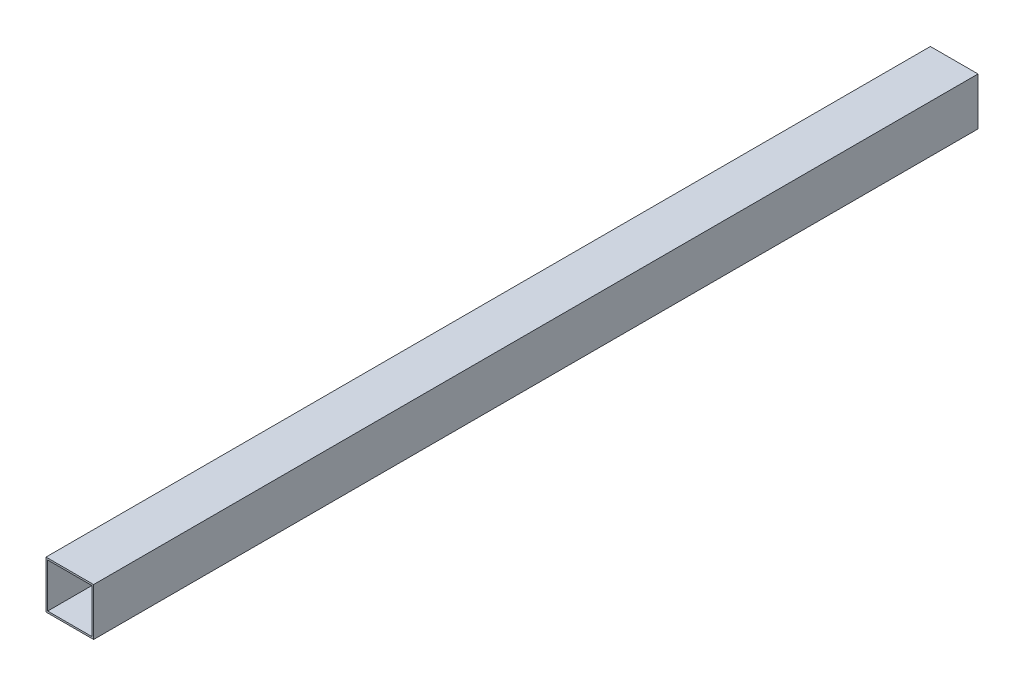
ISO-10303-21;
HEADER;
FILE_DESCRIPTION(('STEP AP214'),'2;1');
FILE_NAME('part.step','',(''),(''),'','','');
FILE_SCHEMA(('AUTOMOTIVE_DESIGN { 1 0 10303 214 1 1 1 1 }'));
ENDSEC;
DATA;
#1=APPLICATION_CONTEXT('core data for automotive mechanical design processes');
#2=APPLICATION_PROTOCOL_DEFINITION('international standard','automotive_design',2000,#1);
#3=PRODUCT_CONTEXT('',#1,'mechanical');
#4=PRODUCT('Part','Part','',(#3));
#5=PRODUCT_RELATED_PRODUCT_CATEGORY('part','',(#4));
#6=PRODUCT_DEFINITION_FORMATION('','',#4);
#7=PRODUCT_DEFINITION_CONTEXT('part definition',#1,'design');
#8=PRODUCT_DEFINITION('design','',#6,#7);
#9=PRODUCT_DEFINITION_SHAPE('','',#8);
#10=(LENGTH_UNIT() NAMED_UNIT(*) SI_UNIT(.MILLI.,.METRE.));
#11=(NAMED_UNIT(*) PLANE_ANGLE_UNIT() SI_UNIT($,.RADIAN.));
#12=(NAMED_UNIT(*) SI_UNIT($,.STERADIAN.) SOLID_ANGLE_UNIT());
#13=UNCERTAINTY_MEASURE_WITH_UNIT(LENGTH_MEASURE(1.E-05),#10,'distance_accuracy_value','');
#14=(GEOMETRIC_REPRESENTATION_CONTEXT(3) GLOBAL_UNCERTAINTY_ASSIGNED_CONTEXT((#13)) GLOBAL_UNIT_ASSIGNED_CONTEXT((#10,
#11,#12)) REPRESENTATION_CONTEXT('',''));
#15=CARTESIAN_POINT('',(0.,0.,0.));
#16=DIRECTION('',(0.,0.,1.));
#17=DIRECTION('',(1.,0.,0.));
#18=AXIS2_PLACEMENT_3D('',#15,#16,#17);
#19=CARTESIAN_POINT('',(0.,0.,650.));
#20=DIRECTION('',(0.,0.,1.));
#21=DIRECTION('',(1.,0.,0.));
#22=AXIS2_PLACEMENT_3D('',#19,#20,#21);
#23=PLANE('',#22);
#24=DIRECTION('',(0.,-1.,0.));
#25=VECTOR('',#24,1.);
#26=CARTESIAN_POINT('',(-35.,-35.,650.));
#27=LINE('',#26,#25);
#28=CARTESIAN_POINT('',(-35.,35.,650.));
#29=VERTEX_POINT('',#28);
#30=CARTESIAN_POINT('',(-35.,-35.,650.));
#31=VERTEX_POINT('',#30);
#32=EDGE_CURVE('E133',#29,#31,#27,.T.);
#33=ORIENTED_EDGE('',*,*,#32,.T.);
#34=DIRECTION('',(1.,0.,0.));
#35=VECTOR('',#34,1.);
#36=CARTESIAN_POINT('',(35.,-35.,650.));
#37=LINE('',#36,#35);
#38=CARTESIAN_POINT('',(35.,-35.,650.));
#39=VERTEX_POINT('',#38);
#40=EDGE_CURVE('E136',#31,#39,#37,.T.);
#41=ORIENTED_EDGE('',*,*,#40,.T.);
#42=DIRECTION('',(0.,1.,0.));
#43=VECTOR('',#42,1.);
#44=CARTESIAN_POINT('',(35.,-35.,650.));
#45=LINE('',#44,#43);
#46=CARTESIAN_POINT('',(35.,35.,650.));
#47=VERTEX_POINT('',#46);
#48=EDGE_CURVE('E139',#39,#47,#45,.T.);
#49=ORIENTED_EDGE('',*,*,#48,.T.);
#50=DIRECTION('',(-1.,0.,0.));
#51=VECTOR('',#50,1.);
#52=CARTESIAN_POINT('',(35.,35.,650.));
#53=LINE('',#52,#51);
#54=EDGE_CURVE('E141',#47,#29,#53,.T.);
#55=ORIENTED_EDGE('',*,*,#54,.T.);
#56=EDGE_LOOP('',(#33,#41,#49,#55));
#57=FACE_BOUND('',#56,.T.);
#58=DIRECTION('',(0.,1.,0.));
#59=VECTOR('',#58,1.);
#60=CARTESIAN_POINT('',(32.5,-32.5,650.));
#61=LINE('',#60,#59);
#62=CARTESIAN_POINT('',(32.5,-32.5,650.));
#63=VERTEX_POINT('',#62);
#64=CARTESIAN_POINT('',(32.5,32.5,650.));
#65=VERTEX_POINT('',#64);
#66=EDGE_CURVE('E105',#63,#65,#61,.T.);
#67=ORIENTED_EDGE('',*,*,#66,.F.);
#68=DIRECTION('',(1.,0.,0.));
#69=VECTOR('',#68,1.);
#70=CARTESIAN_POINT('',(32.5,-32.5,650.));
#71=LINE('',#70,#69);
#72=CARTESIAN_POINT('',(-32.5,-32.5,650.));
#73=VERTEX_POINT('',#72);
#74=EDGE_CURVE('E97',#73,#63,#71,.T.);
#75=ORIENTED_EDGE('',*,*,#74,.F.);
#76=DIRECTION('',(0.,-1.,0.));
#77=VECTOR('',#76,1.);
#78=CARTESIAN_POINT('',(-32.5,-32.5,650.));
#79=LINE('',#78,#77);
#80=CARTESIAN_POINT('',(-32.5,32.5,650.));
#81=VERTEX_POINT('',#80);
#82=EDGE_CURVE('E119',#81,#73,#79,.T.);
#83=ORIENTED_EDGE('',*,*,#82,.F.);
#84=DIRECTION('',(-1.,0.,0.));
#85=VECTOR('',#84,1.);
#86=CARTESIAN_POINT('',(32.5,32.5,650.));
#87=LINE('',#86,#85);
#88=EDGE_CURVE('E117',#65,#81,#87,.T.);
#89=ORIENTED_EDGE('',*,*,#88,.F.);
#90=EDGE_LOOP('',(#67,#75,#83,#89));
#91=FACE_BOUND('',#90,.T.);
#92=ADVANCED_FACE('F32',(#57,#91),#23,.T.);
#93=CARTESIAN_POINT('',(0.,0.,-650.));
#94=DIRECTION('',(0.,0.,1.));
#95=DIRECTION('',(1.,0.,0.));
#96=AXIS2_PLACEMENT_3D('',#93,#94,#95);
#97=PLANE('',#96);
#98=DIRECTION('',(0.,-1.,0.));
#99=VECTOR('',#98,1.);
#100=CARTESIAN_POINT('',(-35.,-35.,-650.));
#101=LINE('',#100,#99);
#102=CARTESIAN_POINT('',(-35.,35.,-650.));
#103=VERTEX_POINT('',#102);
#104=CARTESIAN_POINT('',(-35.,-35.,-650.));
#105=VERTEX_POINT('',#104);
#106=EDGE_CURVE('E113',#103,#105,#101,.T.);
#107=ORIENTED_EDGE('',*,*,#106,.F.);
#108=DIRECTION('',(-1.,0.,0.));
#109=VECTOR('',#108,1.);
#110=CARTESIAN_POINT('',(35.,35.,-650.));
#111=LINE('',#110,#109);
#112=CARTESIAN_POINT('',(35.,35.,-650.));
#113=VERTEX_POINT('',#112);
#114=EDGE_CURVE('E137',#113,#103,#111,.T.);
#115=ORIENTED_EDGE('',*,*,#114,.F.);
#116=DIRECTION('',(0.,1.,0.));
#117=VECTOR('',#116,1.);
#118=CARTESIAN_POINT('',(35.,-35.,-650.));
#119=LINE('',#118,#117);
#120=CARTESIAN_POINT('',(35.,-35.,-650.));
#121=VERTEX_POINT('',#120);
#122=EDGE_CURVE('E148',#121,#113,#119,.T.);
#123=ORIENTED_EDGE('',*,*,#122,.F.);
#124=DIRECTION('',(1.,0.,0.));
#125=VECTOR('',#124,1.);
#126=CARTESIAN_POINT('',(35.,-35.,-650.));
#127=LINE('',#126,#125);
#128=EDGE_CURVE('E146',#105,#121,#127,.T.);
#129=ORIENTED_EDGE('',*,*,#128,.F.);
#130=EDGE_LOOP('',(#107,#115,#123,#129));
#131=FACE_BOUND('',#130,.T.);
#132=DIRECTION('',(1.,0.,0.));
#133=VECTOR('',#132,1.);
#134=CARTESIAN_POINT('',(32.5,-32.5,-650.));
#135=LINE('',#134,#133);
#136=CARTESIAN_POINT('',(-32.5,-32.5,-650.));
#137=VERTEX_POINT('',#136);
#138=CARTESIAN_POINT('',(32.5,-32.5,-650.));
#139=VERTEX_POINT('',#138);
#140=EDGE_CURVE('E55',#137,#139,#135,.T.);
#141=ORIENTED_EDGE('',*,*,#140,.T.);
#142=DIRECTION('',(0.,1.,0.));
#143=VECTOR('',#142,1.);
#144=CARTESIAN_POINT('',(32.5,-32.5,-650.));
#145=LINE('',#144,#143);
#146=CARTESIAN_POINT('',(32.5,32.5,-650.));
#147=VERTEX_POINT('',#146);
#148=EDGE_CURVE('E112',#139,#147,#145,.T.);
#149=ORIENTED_EDGE('',*,*,#148,.T.);
#150=DIRECTION('',(-1.,0.,0.));
#151=VECTOR('',#150,1.);
#152=CARTESIAN_POINT('',(32.5,32.5,-650.));
#153=LINE('',#152,#151);
#154=CARTESIAN_POINT('',(-32.5,32.5,-650.));
#155=VERTEX_POINT('',#154);
#156=EDGE_CURVE('E125',#147,#155,#153,.T.);
#157=ORIENTED_EDGE('',*,*,#156,.T.);
#158=DIRECTION('',(0.,-1.,0.));
#159=VECTOR('',#158,1.);
#160=CARTESIAN_POINT('',(-32.5,-32.5,-650.));
#161=LINE('',#160,#159);
#162=EDGE_CURVE('E106',#155,#137,#161,.T.);
#163=ORIENTED_EDGE('',*,*,#162,.T.);
#164=EDGE_LOOP('',(#141,#149,#157,#163));
#165=FACE_BOUND('',#164,.T.);
#166=ADVANCED_FACE('F166',(#131,#165),#97,.F.);
#167=CARTESIAN_POINT('',(-35.,-35.,650.));
#168=DIRECTION('',(1.,0.,0.));
#169=DIRECTION('',(0.,0.,-1.));
#170=AXIS2_PLACEMENT_3D('',#167,#168,#169);
#171=PLANE('',#170);
#172=ORIENTED_EDGE('',*,*,#106,.T.);
#173=DIRECTION('',(0.,0.,-1.));
#174=VECTOR('',#173,1.);
#175=CARTESIAN_POINT('',(-35.,-35.,650.));
#176=LINE('',#175,#174);
#177=EDGE_CURVE('E11',#31,#105,#176,.T.);
#178=ORIENTED_EDGE('',*,*,#177,.F.);
#179=ORIENTED_EDGE('',*,*,#32,.F.);
#180=DIRECTION('',(0.,0.,-1.));
#181=VECTOR('',#180,1.);
#182=CARTESIAN_POINT('',(-35.,35.,650.));
#183=LINE('',#182,#181);
#184=EDGE_CURVE('E143',#29,#103,#183,.T.);
#185=ORIENTED_EDGE('',*,*,#184,.T.);
#186=EDGE_LOOP('',(#172,#178,#179,#185));
#187=FACE_BOUND('',#186,.T.);
#188=ADVANCED_FACE('F34',(#187),#171,.F.);
#189=CARTESIAN_POINT('',(35.,-35.,650.));
#190=DIRECTION('',(0.,1.,0.));
#191=DIRECTION('',(-1.,0.,0.));
#192=AXIS2_PLACEMENT_3D('',#189,#190,#191);
#193=PLANE('',#192);
#194=ORIENTED_EDGE('',*,*,#128,.T.);
#195=DIRECTION('',(0.,0.,-1.));
#196=VECTOR('',#195,1.);
#197=CARTESIAN_POINT('',(35.,-35.,650.));
#198=LINE('',#197,#196);
#199=EDGE_CURVE('E40',#39,#121,#198,.T.);
#200=ORIENTED_EDGE('',*,*,#199,.F.);
#201=ORIENTED_EDGE('',*,*,#40,.F.);
#202=ORIENTED_EDGE('',*,*,#177,.T.);
#203=EDGE_LOOP('',(#194,#200,#201,#202));
#204=FACE_BOUND('',#203,.T.);
#205=ADVANCED_FACE('F176',(#204),#193,.F.);
#206=CARTESIAN_POINT('',(35.,-35.,650.));
#207=DIRECTION('',(-1.,0.,0.));
#208=DIRECTION('',(0.,0.,1.));
#209=AXIS2_PLACEMENT_3D('',#206,#207,#208);
#210=PLANE('',#209);
#211=ORIENTED_EDGE('',*,*,#122,.T.);
#212=DIRECTION('',(0.,0.,-1.));
#213=VECTOR('',#212,1.);
#214=CARTESIAN_POINT('',(35.,35.,650.));
#215=LINE('',#214,#213);
#216=EDGE_CURVE('E153',#47,#113,#215,.T.);
#217=ORIENTED_EDGE('',*,*,#216,.F.);
#218=ORIENTED_EDGE('',*,*,#48,.F.);
#219=ORIENTED_EDGE('',*,*,#199,.T.);
#220=EDGE_LOOP('',(#211,#217,#218,#219));
#221=FACE_BOUND('',#220,.T.);
#222=ADVANCED_FACE('F160',(#221),#210,.F.);
#223=CARTESIAN_POINT('',(35.,35.,650.));
#224=DIRECTION('',(0.,-1.,0.));
#225=DIRECTION('',(1.,0.,0.));
#226=AXIS2_PLACEMENT_3D('',#223,#224,#225);
#227=PLANE('',#226);
#228=ORIENTED_EDGE('',*,*,#114,.T.);
#229=ORIENTED_EDGE('',*,*,#184,.F.);
#230=ORIENTED_EDGE('',*,*,#54,.F.);
#231=ORIENTED_EDGE('',*,*,#216,.T.);
#232=EDGE_LOOP('',(#228,#229,#230,#231));
#233=FACE_BOUND('',#232,.T.);
#234=ADVANCED_FACE('F170',(#233),#227,.F.);
#235=CARTESIAN_POINT('',(32.5,-32.5,650.));
#236=DIRECTION('',(0.,1.,0.));
#237=DIRECTION('',(0.,0.,1.));
#238=AXIS2_PLACEMENT_3D('',#235,#236,#237);
#239=PLANE('',#238);
#240=ORIENTED_EDGE('',*,*,#140,.F.);
#241=DIRECTION('',(0.,0.,-1.));
#242=VECTOR('',#241,1.);
#243=CARTESIAN_POINT('',(-32.5,-32.5,650.));
#244=LINE('',#243,#242);
#245=EDGE_CURVE('E101',#73,#137,#244,.T.);
#246=ORIENTED_EDGE('',*,*,#245,.F.);
#247=ORIENTED_EDGE('',*,*,#74,.T.);
#248=DIRECTION('',(0.,0.,-1.));
#249=VECTOR('',#248,1.);
#250=CARTESIAN_POINT('',(32.5,-32.5,650.));
#251=LINE('',#250,#249);
#252=EDGE_CURVE('E100',#63,#139,#251,.T.);
#253=ORIENTED_EDGE('',*,*,#252,.T.);
#254=EDGE_LOOP('',(#240,#246,#247,#253));
#255=FACE_BOUND('',#254,.T.);
#256=ADVANCED_FACE('F99',(#255),#239,.T.);
#257=CARTESIAN_POINT('',(32.5,-32.5,650.));
#258=DIRECTION('',(-1.,0.,0.));
#259=DIRECTION('',(0.,0.,1.));
#260=AXIS2_PLACEMENT_3D('',#257,#258,#259);
#261=PLANE('',#260);
#262=ORIENTED_EDGE('',*,*,#148,.F.);
#263=ORIENTED_EDGE('',*,*,#252,.F.);
#264=ORIENTED_EDGE('',*,*,#66,.T.);
#265=DIRECTION('',(0.,0.,-1.));
#266=VECTOR('',#265,1.);
#267=CARTESIAN_POINT('',(32.5,32.5,650.));
#268=LINE('',#267,#266);
#269=EDGE_CURVE('E114',#65,#147,#268,.T.);
#270=ORIENTED_EDGE('',*,*,#269,.T.);
#271=EDGE_LOOP('',(#262,#263,#264,#270));
#272=FACE_BOUND('',#271,.T.);
#273=ADVANCED_FACE('F109',(#272),#261,.T.);
#274=CARTESIAN_POINT('',(32.5,32.5,650.));
#275=DIRECTION('',(0.,-1.,0.));
#276=DIRECTION('',(1.,0.,0.));
#277=AXIS2_PLACEMENT_3D('',#274,#275,#276);
#278=PLANE('',#277);
#279=ORIENTED_EDGE('',*,*,#156,.F.);
#280=ORIENTED_EDGE('',*,*,#269,.F.);
#281=ORIENTED_EDGE('',*,*,#88,.T.);
#282=DIRECTION('',(0.,0.,-1.));
#283=VECTOR('',#282,1.);
#284=CARTESIAN_POINT('',(-32.5,32.5,650.));
#285=LINE('',#284,#283);
#286=EDGE_CURVE('E47',#81,#155,#285,.T.);
#287=ORIENTED_EDGE('',*,*,#286,.T.);
#288=EDGE_LOOP('',(#279,#280,#281,#287));
#289=FACE_BOUND('',#288,.T.);
#290=ADVANCED_FACE('F199',(#289),#278,.T.);
#291=CARTESIAN_POINT('',(-32.5,-32.5,650.));
#292=DIRECTION('',(1.,0.,0.));
#293=DIRECTION('',(0.,0.,-1.));
#294=AXIS2_PLACEMENT_3D('',#291,#292,#293);
#295=PLANE('',#294);
#296=ORIENTED_EDGE('',*,*,#162,.F.);
#297=ORIENTED_EDGE('',*,*,#286,.F.);
#298=ORIENTED_EDGE('',*,*,#82,.T.);
#299=ORIENTED_EDGE('',*,*,#245,.T.);
#300=EDGE_LOOP('',(#296,#297,#298,#299));
#301=FACE_BOUND('',#300,.T.);
#302=ADVANCED_FACE('F203',(#301),#295,.T.);
#303=CLOSED_SHELL('',(#92,#166,#188,#205,#222,#234,#256,#273,#290,#302));
#304=MANIFOLD_SOLID_BREP('B2',#303);
#305=ADVANCED_BREP_SHAPE_REPRESENTATION('',(#18,#304),#14);
#306=SHAPE_DEFINITION_REPRESENTATION(#9,#305);
ENDSEC;
END-ISO-10303-21;
